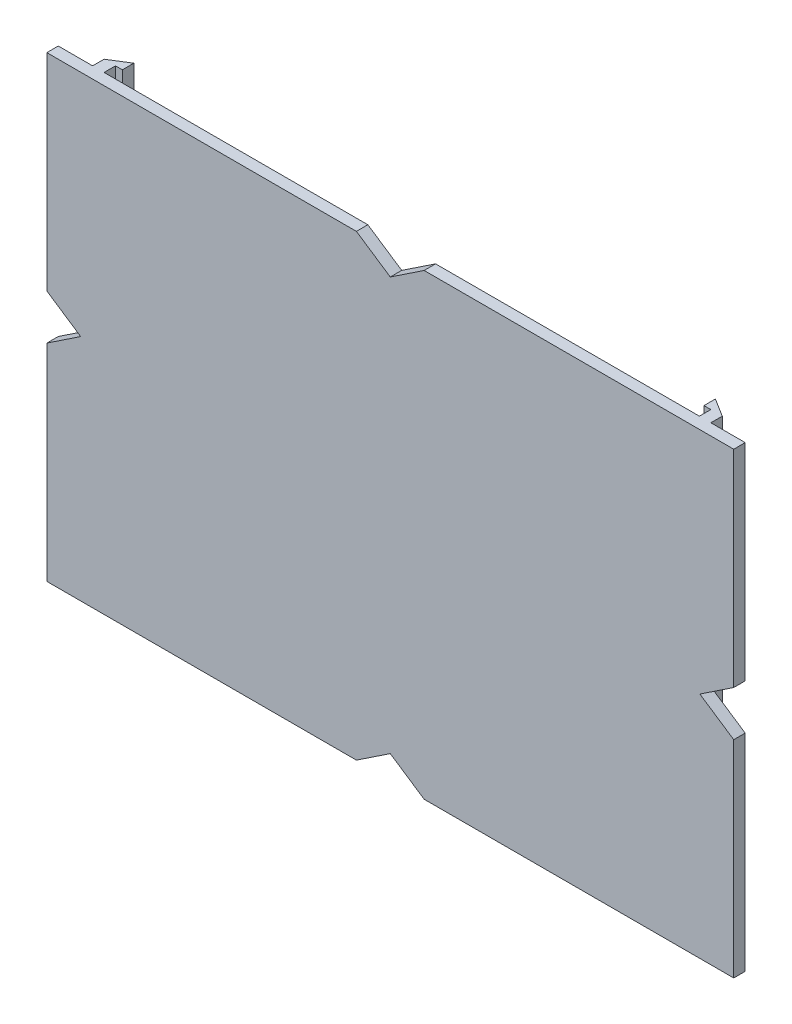
ISO-10303-21;
HEADER;
FILE_DESCRIPTION(('STEP AP214'),'2;1');
FILE_NAME('part.step','',(''),(''),'','','');
FILE_SCHEMA(('AUTOMOTIVE_DESIGN { 1 0 10303 214 1 1 1 1 }'));
ENDSEC;
DATA;
#1=APPLICATION_CONTEXT('core data for automotive mechanical design processes');
#2=APPLICATION_PROTOCOL_DEFINITION('international standard','automotive_design',2000,#1);
#3=PRODUCT_CONTEXT('',#1,'mechanical');
#4=PRODUCT('Part','Part','',(#3));
#5=PRODUCT_RELATED_PRODUCT_CATEGORY('part','',(#4));
#6=PRODUCT_DEFINITION_FORMATION('','',#4);
#7=PRODUCT_DEFINITION_CONTEXT('part definition',#1,'design');
#8=PRODUCT_DEFINITION('design','',#6,#7);
#9=PRODUCT_DEFINITION_SHAPE('','',#8);
#10=(LENGTH_UNIT() NAMED_UNIT(*) SI_UNIT(.MILLI.,.METRE.));
#11=(NAMED_UNIT(*) PLANE_ANGLE_UNIT() SI_UNIT($,.RADIAN.));
#12=(NAMED_UNIT(*) SI_UNIT($,.STERADIAN.) SOLID_ANGLE_UNIT());
#13=UNCERTAINTY_MEASURE_WITH_UNIT(LENGTH_MEASURE(1.E-05),#10,'distance_accuracy_value','');
#14=(GEOMETRIC_REPRESENTATION_CONTEXT(3) GLOBAL_UNCERTAINTY_ASSIGNED_CONTEXT((#13)) GLOBAL_UNIT_ASSIGNED_CONTEXT((#10,
#11,#12)) REPRESENTATION_CONTEXT('',''));
#15=CARTESIAN_POINT('',(0.,0.,0.));
#16=DIRECTION('',(0.,0.,1.));
#17=DIRECTION('',(1.,0.,0.));
#18=AXIS2_PLACEMENT_3D('',#15,#16,#17);
#19=CARTESIAN_POINT('',(0.,0.,0.));
#20=DIRECTION('',(0.,0.,1.));
#21=DIRECTION('',(1.,0.,0.));
#22=AXIS2_PLACEMENT_3D('',#19,#20,#21);
#23=PLANE('',#22);
#24=DIRECTION('',(0.,1.,0.));
#25=VECTOR('',#24,1.);
#26=CARTESIAN_POINT('',(130.,-112.806248474866,0.));
#27=LINE('',#26,#25);
#28=CARTESIAN_POINT('',(130.,-100.,0.));
#29=VERTEX_POINT('',#28);
#30=CARTESIAN_POINT('',(130.,100.,0.));
#31=VERTEX_POINT('',#30);
#32=EDGE_CURVE('E287',#29,#31,#27,.T.);
#33=ORIENTED_EDGE('',*,*,#32,.F.);
#34=DIRECTION('',(1.,0.,0.));
#35=VECTOR('',#34,1.);
#36=CARTESIAN_POINT('',(0.,-100.,0.));
#37=LINE('',#36,#35);
#38=CARTESIAN_POINT('',(14.7918271701004,-100.,0.));
#39=VERTEX_POINT('',#38);
#40=EDGE_CURVE('E442',#39,#29,#37,.T.);
#41=ORIENTED_EDGE('',*,*,#40,.F.);
#42=DIRECTION('',(0.832050294337844,-0.554700196225229,0.));
#43=VECTOR('',#42,1.);
#44=CARTESIAN_POINT('',(-41.6025147168922,-62.4037720753383,0.));
#45=LINE('',#44,#43);
#46=CARTESIAN_POINT('',(0.,-90.1387818865997,0.));
#47=VERTEX_POINT('',#46);
#48=EDGE_CURVE('E445',#47,#39,#45,.T.);
#49=ORIENTED_EDGE('',*,*,#48,.F.);
#50=DIRECTION('',(0.832050294337844,0.554700196225229,0.));
#51=VECTOR('',#50,1.);
#52=CARTESIAN_POINT('',(41.6025147168922,-62.4037720753382,0.));
#53=LINE('',#52,#51);
#54=CARTESIAN_POINT('',(-14.7918271701005,-100.,0.));
#55=VERTEX_POINT('',#54);
#56=EDGE_CURVE('E439',#55,#47,#53,.T.);
#57=ORIENTED_EDGE('',*,*,#56,.F.);
#58=CARTESIAN_POINT('',(-130.,-100.,0.));
#59=VERTEX_POINT('',#58);
#60=EDGE_CURVE('E440',#59,#55,#37,.T.);
#61=ORIENTED_EDGE('',*,*,#60,.F.);
#62=DIRECTION('',(0.,1.,0.));
#63=VECTOR('',#62,1.);
#64=CARTESIAN_POINT('',(-130.,-112.806248474866,0.));
#65=LINE('',#64,#63);
#66=CARTESIAN_POINT('',(-130.,100.,0.));
#67=VERTEX_POINT('',#66);
#68=EDGE_CURVE('E339',#59,#67,#65,.T.);
#69=ORIENTED_EDGE('',*,*,#68,.T.);
#70=DIRECTION('',(1.,0.,0.));
#71=VECTOR('',#70,1.);
#72=CARTESIAN_POINT('',(0.,100.,0.));
#73=LINE('',#72,#71);
#74=CARTESIAN_POINT('',(-14.7918271701004,100.,0.));
#75=VERTEX_POINT('',#74);
#76=EDGE_CURVE('E422',#67,#75,#73,.T.);
#77=ORIENTED_EDGE('',*,*,#76,.T.);
#78=DIRECTION('',(0.832050294337844,-0.554700196225229,0.));
#79=VECTOR('',#78,1.);
#80=CARTESIAN_POINT('',(41.6025147168922,62.4037720753382,0.));
#81=LINE('',#80,#79);
#82=CARTESIAN_POINT('',(0.,90.1387818865997,0.));
#83=VERTEX_POINT('',#82);
#84=EDGE_CURVE('E418',#75,#83,#81,.T.);
#85=ORIENTED_EDGE('',*,*,#84,.T.);
#86=DIRECTION('',(0.832050294337844,0.554700196225229,0.));
#87=VECTOR('',#86,1.);
#88=CARTESIAN_POINT('',(-41.6025147168922,62.4037720753383,0.));
#89=LINE('',#88,#87);
#90=CARTESIAN_POINT('',(14.7918271701004,100.,0.));
#91=VERTEX_POINT('',#90);
#92=EDGE_CURVE('E413',#83,#91,#89,.T.);
#93=ORIENTED_EDGE('',*,*,#92,.T.);
#94=EDGE_CURVE('E409',#91,#31,#73,.T.);
#95=ORIENTED_EDGE('',*,*,#94,.T.);
#96=EDGE_LOOP('',(#33,#41,#49,#57,#61,#69,#77,#85,#93,#95));
#97=FACE_BOUND('',#96,.T.);
#98=ADVANCED_FACE('F53',(#97),#23,.F.);
#99=DIRECTION('',(0.,1.,0.));
#100=VECTOR('',#99,1.);
#101=CARTESIAN_POINT('',(135.,-112.806248474866,0.));
#102=LINE('',#101,#100);
#103=CARTESIAN_POINT('',(135.,-100.,0.));
#104=VERTEX_POINT('',#103);
#105=CARTESIAN_POINT('',(135.,100.,0.));
#106=VERTEX_POINT('',#105);
#107=EDGE_CURVE('E69',#104,#106,#102,.T.);
#108=ORIENTED_EDGE('',*,*,#107,.T.);
#109=CARTESIAN_POINT('',(150.,100.,0.));
#110=VERTEX_POINT('',#109);
#111=EDGE_CURVE('E408',#106,#110,#73,.T.);
#112=ORIENTED_EDGE('',*,*,#111,.T.);
#113=DIRECTION('',(0.,-1.,0.));
#114=VECTOR('',#113,1.);
#115=CARTESIAN_POINT('',(150.,0.,0.));
#116=LINE('',#115,#114);
#117=CARTESIAN_POINT('',(150.,9.86121811340041,0.));
#118=VERTEX_POINT('',#117);
#119=EDGE_CURVE('E404',#110,#118,#116,.T.);
#120=ORIENTED_EDGE('',*,*,#119,.T.);
#121=DIRECTION('',(0.832050294337844,0.554700196225229,0.));
#122=VECTOR('',#121,1.);
#123=CARTESIAN_POINT('',(41.6025147168922,-62.4037720753382,0.));
#124=LINE('',#123,#122);
#125=CARTESIAN_POINT('',(135.208172829899,0.,0.));
#126=VERTEX_POINT('',#125);
#127=EDGE_CURVE('E400',#126,#118,#124,.T.);
#128=ORIENTED_EDGE('',*,*,#127,.F.);
#129=DIRECTION('',(0.832050294337844,-0.554700196225229,0.));
#130=VECTOR('',#129,1.);
#131=CARTESIAN_POINT('',(41.6025147168921,62.4037720753382,0.));
#132=LINE('',#131,#130);
#133=CARTESIAN_POINT('',(150.,-9.86121811340035,0.));
#134=VERTEX_POINT('',#133);
#135=EDGE_CURVE('E349',#126,#134,#132,.T.);
#136=ORIENTED_EDGE('',*,*,#135,.T.);
#137=CARTESIAN_POINT('',(150.,-100.,0.));
#138=VERTEX_POINT('',#137);
#139=EDGE_CURVE('E355',#134,#138,#116,.T.);
#140=ORIENTED_EDGE('',*,*,#139,.T.);
#141=EDGE_CURVE('E441',#104,#138,#37,.T.);
#142=ORIENTED_EDGE('',*,*,#141,.F.);
#143=EDGE_LOOP('',(#108,#112,#120,#128,#136,#140,#142));
#144=FACE_BOUND('',#143,.T.);
#145=ADVANCED_FACE('F509',(#144),#23,.F.);
#146=DIRECTION('',(0.,1.,0.));
#147=VECTOR('',#146,1.);
#148=CARTESIAN_POINT('',(-135.,-112.806248474866,0.));
#149=LINE('',#148,#147);
#150=CARTESIAN_POINT('',(-135.,-100.,0.));
#151=VERTEX_POINT('',#150);
#152=CARTESIAN_POINT('',(-135.,100.,0.));
#153=VERTEX_POINT('',#152);
#154=EDGE_CURVE('E342',#151,#153,#149,.T.);
#155=ORIENTED_EDGE('',*,*,#154,.F.);
#156=CARTESIAN_POINT('',(-150.,-100.,0.));
#157=VERTEX_POINT('',#156);
#158=EDGE_CURVE('E435',#157,#151,#37,.T.);
#159=ORIENTED_EDGE('',*,*,#158,.F.);
#160=DIRECTION('',(0.,-1.,0.));
#161=VECTOR('',#160,1.);
#162=CARTESIAN_POINT('',(-150.,0.,0.));
#163=LINE('',#162,#161);
#164=CARTESIAN_POINT('',(-150.,-9.86121811340024,0.));
#165=VERTEX_POINT('',#164);
#166=EDGE_CURVE('E427',#165,#157,#163,.T.);
#167=ORIENTED_EDGE('',*,*,#166,.F.);
#168=DIRECTION('',(0.832050294337844,0.554700196225229,0.));
#169=VECTOR('',#168,1.);
#170=CARTESIAN_POINT('',(-41.6025147168922,62.4037720753383,0.));
#171=LINE('',#170,#169);
#172=CARTESIAN_POINT('',(-135.2081728299,0.,0.));
#173=VERTEX_POINT('',#172);
#174=EDGE_CURVE('E431',#165,#173,#171,.T.);
#175=ORIENTED_EDGE('',*,*,#174,.T.);
#176=DIRECTION('',(0.832050294337844,-0.554700196225229,0.));
#177=VECTOR('',#176,1.);
#178=CARTESIAN_POINT('',(-41.6025147168921,-62.4037720753383,0.));
#179=LINE('',#178,#177);
#180=CARTESIAN_POINT('',(-150.,9.86121811340027,0.));
#181=VERTEX_POINT('',#180);
#182=EDGE_CURVE('E426',#181,#173,#179,.T.);
#183=ORIENTED_EDGE('',*,*,#182,.F.);
#184=CARTESIAN_POINT('',(-150.,100.,0.));
#185=VERTEX_POINT('',#184);
#186=EDGE_CURVE('E423',#185,#181,#163,.T.);
#187=ORIENTED_EDGE('',*,*,#186,.F.);
#188=EDGE_CURVE('E414',#185,#153,#73,.T.);
#189=ORIENTED_EDGE('',*,*,#188,.T.);
#190=EDGE_LOOP('',(#155,#159,#167,#175,#183,#187,#189));
#191=FACE_BOUND('',#190,.T.);
#192=ADVANCED_FACE('F547',(#191),#23,.F.);
#193=CARTESIAN_POINT('',(41.6025147168921,62.4037720753382,5.));
#194=DIRECTION('',(0.554700196225229,0.832050294337844,0.));
#195=DIRECTION('',(-0.832050294337844,0.554700196225229,0.));
#196=AXIS2_PLACEMENT_3D('',#193,#194,#195);
#197=PLANE('',#196);
#198=ORIENTED_EDGE('',*,*,#135,.F.);
#199=DIRECTION('',(0.,0.,-1.));
#200=VECTOR('',#199,1.);
#201=CARTESIAN_POINT('',(135.208172829899,0.,5.));
#202=LINE('',#201,#200);
#203=CARTESIAN_POINT('',(135.208172829899,0.,5.));
#204=VERTEX_POINT('',#203);
#205=EDGE_CURVE('E11',#204,#126,#202,.T.);
#206=ORIENTED_EDGE('',*,*,#205,.F.);
#207=DIRECTION('',(0.832050294337844,-0.554700196225229,0.));
#208=VECTOR('',#207,1.);
#209=CARTESIAN_POINT('',(41.6025147168921,62.4037720753382,5.));
#210=LINE('',#209,#208);
#211=CARTESIAN_POINT('',(150.,-9.86121811340035,5.));
#212=VERTEX_POINT('',#211);
#213=EDGE_CURVE('E350',#204,#212,#210,.T.);
#214=ORIENTED_EDGE('',*,*,#213,.T.);
#215=DIRECTION('',(0.,0.,-1.));
#216=VECTOR('',#215,1.);
#217=CARTESIAN_POINT('',(150.,-9.86121811340035,5.));
#218=LINE('',#217,#216);
#219=EDGE_CURVE('E448',#212,#134,#218,.T.);
#220=ORIENTED_EDGE('',*,*,#219,.T.);
#221=EDGE_LOOP('',(#198,#206,#214,#220));
#222=FACE_BOUND('',#221,.T.);
#223=ADVANCED_FACE('F55',(#222),#197,.T.);
#224=CARTESIAN_POINT('',(41.6025147168922,-62.4037720753382,5.));
#225=DIRECTION('',(-0.554700196225229,0.832050294337844,0.));
#226=DIRECTION('',(-0.832050294337844,-0.554700196225229,0.));
#227=AXIS2_PLACEMENT_3D('',#224,#225,#226);
#228=PLANE('',#227);
#229=ORIENTED_EDGE('',*,*,#127,.T.);
#230=DIRECTION('',(0.,0.,-1.));
#231=VECTOR('',#230,1.);
#232=CARTESIAN_POINT('',(150.,9.86121811340041,5.));
#233=LINE('',#232,#231);
#234=CARTESIAN_POINT('',(150.,9.86121811340041,5.));
#235=VERTEX_POINT('',#234);
#236=EDGE_CURVE('E62',#235,#118,#233,.T.);
#237=ORIENTED_EDGE('',*,*,#236,.F.);
#238=DIRECTION('',(0.832050294337844,0.554700196225229,0.));
#239=VECTOR('',#238,1.);
#240=CARTESIAN_POINT('',(41.6025147168922,-62.4037720753382,5.));
#241=LINE('',#240,#239);
#242=EDGE_CURVE('E354',#204,#235,#241,.T.);
#243=ORIENTED_EDGE('',*,*,#242,.F.);
#244=ORIENTED_EDGE('',*,*,#205,.T.);
#245=EDGE_LOOP('',(#229,#237,#243,#244));
#246=FACE_BOUND('',#245,.T.);
#247=ADVANCED_FACE('F506',(#246),#228,.F.);
#248=CARTESIAN_POINT('',(150.,0.,5.));
#249=DIRECTION('',(1.,0.,0.));
#250=DIRECTION('',(0.,0.,-1.));
#251=AXIS2_PLACEMENT_3D('',#248,#249,#250);
#252=PLANE('',#251);
#253=ORIENTED_EDGE('',*,*,#119,.F.);
#254=DIRECTION('',(0.,0.,-1.));
#255=VECTOR('',#254,1.);
#256=CARTESIAN_POINT('',(150.,100.,5.));
#257=LINE('',#256,#255);
#258=CARTESIAN_POINT('',(150.,100.,5.));
#259=VERTEX_POINT('',#258);
#260=EDGE_CURVE('E494',#259,#110,#257,.T.);
#261=ORIENTED_EDGE('',*,*,#260,.F.);
#262=DIRECTION('',(0.,-1.,0.));
#263=VECTOR('',#262,1.);
#264=CARTESIAN_POINT('',(150.,0.,5.));
#265=LINE('',#264,#263);
#266=EDGE_CURVE('E358',#259,#235,#265,.T.);
#267=ORIENTED_EDGE('',*,*,#266,.T.);
#268=ORIENTED_EDGE('',*,*,#236,.T.);
#269=EDGE_LOOP('',(#253,#261,#267,#268));
#270=FACE_BOUND('',#269,.T.);
#271=ADVANCED_FACE('F501',(#270),#252,.T.);
#272=CARTESIAN_POINT('',(0.,100.,5.));
#273=DIRECTION('',(0.,1.,0.));
#274=DIRECTION('',(0.,0.,1.));
#275=AXIS2_PLACEMENT_3D('',#272,#273,#274);
#276=PLANE('',#275);
#277=ORIENTED_EDGE('',*,*,#94,.F.);
#278=DIRECTION('',(0.,0.,-1.));
#279=VECTOR('',#278,1.);
#280=CARTESIAN_POINT('',(14.7918271701004,100.,5.));
#281=LINE('',#280,#279);
#282=CARTESIAN_POINT('',(14.7918271701004,100.,5.));
#283=VERTEX_POINT('',#282);
#284=EDGE_CURVE('E491',#283,#91,#281,.T.);
#285=ORIENTED_EDGE('',*,*,#284,.F.);
#286=DIRECTION('',(1.,0.,0.));
#287=VECTOR('',#286,1.);
#288=CARTESIAN_POINT('',(0.,100.,5.));
#289=LINE('',#288,#287);
#290=EDGE_CURVE('E362',#283,#259,#289,.T.);
#291=ORIENTED_EDGE('',*,*,#290,.T.);
#292=ORIENTED_EDGE('',*,*,#260,.T.);
#293=ORIENTED_EDGE('',*,*,#111,.F.);
#294=DIRECTION('',(0.,0.,1.));
#295=VECTOR('',#294,1.);
#296=CARTESIAN_POINT('',(135.,100.,0.));
#297=LINE('',#296,#295);
#298=CARTESIAN_POINT('',(135.,100.,-5.00000000000003));
#299=VERTEX_POINT('',#298);
#300=EDGE_CURVE('E252',#299,#106,#297,.T.);
#301=ORIENTED_EDGE('',*,*,#300,.F.);
#302=DIRECTION('',(0.847998304005088,0.,0.52999894000318));
#303=VECTOR('',#302,1.);
#304=CARTESIAN_POINT('',(40.1685393258427,100.,-64.2696629213483));
#305=LINE('',#304,#303);
#306=CARTESIAN_POINT('',(127.,100.,-10.));
#307=VERTEX_POINT('',#306);
#308=EDGE_CURVE('E246',#307,#299,#305,.T.);
#309=ORIENTED_EDGE('',*,*,#308,.F.);
#310=DIRECTION('',(0.,0.,-1.));
#311=VECTOR('',#310,1.);
#312=CARTESIAN_POINT('',(127.,100.,0.));
#313=LINE('',#312,#311);
#314=CARTESIAN_POINT('',(127.,100.,-5.));
#315=VERTEX_POINT('',#314);
#316=EDGE_CURVE('E255',#315,#307,#313,.T.);
#317=ORIENTED_EDGE('',*,*,#316,.F.);
#318=DIRECTION('',(-1.,0.,0.));
#319=VECTOR('',#318,1.);
#320=CARTESIAN_POINT('',(0.,100.,-5.));
#321=LINE('',#320,#319);
#322=CARTESIAN_POINT('',(130.,100.,-5.));
#323=VERTEX_POINT('',#322);
#324=EDGE_CURVE('E262',#323,#315,#321,.T.);
#325=ORIENTED_EDGE('',*,*,#324,.F.);
#326=DIRECTION('',(0.,0.,-1.));
#327=VECTOR('',#326,1.);
#328=CARTESIAN_POINT('',(130.,100.,0.));
#329=LINE('',#328,#327);
#330=EDGE_CURVE('E275',#31,#323,#329,.T.);
#331=ORIENTED_EDGE('',*,*,#330,.F.);
#332=EDGE_LOOP('',(#277,#285,#291,#292,#293,#301,#309,#317,#325,#331));
#333=FACE_BOUND('',#332,.T.);
#334=ADVANCED_FACE('F266',(#333),#276,.T.);
#335=CARTESIAN_POINT('',(-41.6025147168922,62.4037720753383,5.));
#336=DIRECTION('',(-0.554700196225229,0.832050294337844,0.));
#337=DIRECTION('',(-0.832050294337844,-0.554700196225229,0.));
#338=AXIS2_PLACEMENT_3D('',#335,#336,#337);
#339=PLANE('',#338);
#340=ORIENTED_EDGE('',*,*,#92,.F.);
#341=DIRECTION('',(0.,0.,-1.));
#342=VECTOR('',#341,1.);
#343=CARTESIAN_POINT('',(0.,90.1387818865997,5.));
#344=LINE('',#343,#342);
#345=CARTESIAN_POINT('',(0.,90.1387818865997,5.));
#346=VERTEX_POINT('',#345);
#347=EDGE_CURVE('E488',#346,#83,#344,.T.);
#348=ORIENTED_EDGE('',*,*,#347,.F.);
#349=DIRECTION('',(0.832050294337844,0.554700196225229,0.));
#350=VECTOR('',#349,1.);
#351=CARTESIAN_POINT('',(-41.6025147168922,62.4037720753383,5.));
#352=LINE('',#351,#350);
#353=EDGE_CURVE('E367',#346,#283,#352,.T.);
#354=ORIENTED_EDGE('',*,*,#353,.T.);
#355=ORIENTED_EDGE('',*,*,#284,.T.);
#356=EDGE_LOOP('',(#340,#348,#354,#355));
#357=FACE_BOUND('',#356,.T.);
#358=ADVANCED_FACE('F597',(#357),#339,.T.);
#359=CARTESIAN_POINT('',(41.6025147168922,62.4037720753382,5.));
#360=DIRECTION('',(0.554700196225229,0.832050294337844,0.));
#361=DIRECTION('',(-0.832050294337844,0.554700196225229,0.));
#362=AXIS2_PLACEMENT_3D('',#359,#360,#361);
#363=PLANE('',#362);
#364=ORIENTED_EDGE('',*,*,#84,.F.);
#365=DIRECTION('',(0.,0.,-1.));
#366=VECTOR('',#365,1.);
#367=CARTESIAN_POINT('',(-14.7918271701004,100.,5.));
#368=LINE('',#367,#366);
#369=CARTESIAN_POINT('',(-14.7918271701004,100.,5.));
#370=VERTEX_POINT('',#369);
#371=EDGE_CURVE('E484',#370,#75,#368,.T.);
#372=ORIENTED_EDGE('',*,*,#371,.F.);
#373=DIRECTION('',(0.832050294337844,-0.554700196225229,0.));
#374=VECTOR('',#373,1.);
#375=CARTESIAN_POINT('',(41.6025147168922,62.4037720753382,5.));
#376=LINE('',#375,#374);
#377=EDGE_CURVE('E372',#370,#346,#376,.T.);
#378=ORIENTED_EDGE('',*,*,#377,.T.);
#379=ORIENTED_EDGE('',*,*,#347,.T.);
#380=EDGE_LOOP('',(#364,#372,#378,#379));
#381=FACE_BOUND('',#380,.T.);
#382=ADVANCED_FACE('F601',(#381),#363,.T.);
#383=ORIENTED_EDGE('',*,*,#188,.F.);
#384=DIRECTION('',(0.,0.,-1.));
#385=VECTOR('',#384,1.);
#386=CARTESIAN_POINT('',(-150.,100.,5.));
#387=LINE('',#386,#385);
#388=CARTESIAN_POINT('',(-150.,100.,5.));
#389=VERTEX_POINT('',#388);
#390=EDGE_CURVE('E481',#389,#185,#387,.T.);
#391=ORIENTED_EDGE('',*,*,#390,.F.);
#392=EDGE_CURVE('E368',#389,#370,#289,.T.);
#393=ORIENTED_EDGE('',*,*,#392,.T.);
#394=ORIENTED_EDGE('',*,*,#371,.T.);
#395=ORIENTED_EDGE('',*,*,#76,.F.);
#396=DIRECTION('',(0.,0.,-1.));
#397=VECTOR('',#396,1.);
#398=CARTESIAN_POINT('',(-130.,100.,0.));
#399=LINE('',#398,#397);
#400=CARTESIAN_POINT('',(-130.,100.,-5.));
#401=VERTEX_POINT('',#400);
#402=EDGE_CURVE('E77',#67,#401,#399,.T.);
#403=ORIENTED_EDGE('',*,*,#402,.T.);
#404=DIRECTION('',(1.,0.,0.));
#405=VECTOR('',#404,1.);
#406=CARTESIAN_POINT('',(0.,100.,-5.));
#407=LINE('',#406,#405);
#408=CARTESIAN_POINT('',(-127.,100.,-5.));
#409=VERTEX_POINT('',#408);
#410=EDGE_CURVE('E322',#401,#409,#407,.T.);
#411=ORIENTED_EDGE('',*,*,#410,.T.);
#412=DIRECTION('',(0.,0.,-1.));
#413=VECTOR('',#412,1.);
#414=CARTESIAN_POINT('',(-127.,100.,0.));
#415=LINE('',#414,#413);
#416=CARTESIAN_POINT('',(-127.,100.,-10.));
#417=VERTEX_POINT('',#416);
#418=EDGE_CURVE('E326',#409,#417,#415,.T.);
#419=ORIENTED_EDGE('',*,*,#418,.T.);
#420=DIRECTION('',(-0.847998304005088,0.,0.52999894000318));
#421=VECTOR('',#420,1.);
#422=CARTESIAN_POINT('',(-40.1685393258427,100.,-64.2696629213483));
#423=LINE('',#422,#421);
#424=CARTESIAN_POINT('',(-135.,100.,-5.00000000000003));
#425=VERTEX_POINT('',#424);
#426=EDGE_CURVE('E312',#417,#425,#423,.T.);
#427=ORIENTED_EDGE('',*,*,#426,.T.);
#428=DIRECTION('',(0.,0.,1.));
#429=VECTOR('',#428,1.);
#430=CARTESIAN_POINT('',(-135.,100.,0.));
#431=LINE('',#430,#429);
#432=EDGE_CURVE('E316',#425,#153,#431,.T.);
#433=ORIENTED_EDGE('',*,*,#432,.T.);
#434=EDGE_LOOP('',(#383,#391,#393,#394,#395,#403,#411,#419,#427,#433));
#435=FACE_BOUND('',#434,.T.);
#436=ADVANCED_FACE('F556',(#435),#276,.T.);
#437=CARTESIAN_POINT('',(-150.,0.,5.));
#438=DIRECTION('',(1.,0.,0.));
#439=DIRECTION('',(0.,1.,0.));
#440=AXIS2_PLACEMENT_3D('',#437,#438,#439);
#441=PLANE('',#440);
#442=ORIENTED_EDGE('',*,*,#186,.T.);
#443=DIRECTION('',(0.,0.,-1.));
#444=VECTOR('',#443,1.);
#445=CARTESIAN_POINT('',(-150.,9.86121811340027,5.));
#446=LINE('',#445,#444);
#447=CARTESIAN_POINT('',(-150.,9.86121811340027,5.));
#448=VERTEX_POINT('',#447);
#449=EDGE_CURVE('E477',#448,#181,#446,.T.);
#450=ORIENTED_EDGE('',*,*,#449,.F.);
#451=DIRECTION('',(0.,-1.,0.));
#452=VECTOR('',#451,1.);
#453=CARTESIAN_POINT('',(-150.,0.,5.));
#454=LINE('',#453,#452);
#455=EDGE_CURVE('E376',#389,#448,#454,.T.);
#456=ORIENTED_EDGE('',*,*,#455,.F.);
#457=ORIENTED_EDGE('',*,*,#390,.T.);
#458=EDGE_LOOP('',(#442,#450,#456,#457));
#459=FACE_BOUND('',#458,.T.);
#460=ADVANCED_FACE('F609',(#459),#441,.F.);
#461=CARTESIAN_POINT('',(-41.6025147168921,-62.4037720753383,5.));
#462=DIRECTION('',(0.554700196225229,0.832050294337844,0.));
#463=DIRECTION('',(-0.832050294337844,0.554700196225229,0.));
#464=AXIS2_PLACEMENT_3D('',#461,#462,#463);
#465=PLANE('',#464);
#466=ORIENTED_EDGE('',*,*,#182,.T.);
#467=DIRECTION('',(0.,0.,-1.));
#468=VECTOR('',#467,1.);
#469=CARTESIAN_POINT('',(-135.2081728299,0.,5.));
#470=LINE('',#469,#468);
#471=CARTESIAN_POINT('',(-135.2081728299,0.,5.));
#472=VERTEX_POINT('',#471);
#473=EDGE_CURVE('E474',#472,#173,#470,.T.);
#474=ORIENTED_EDGE('',*,*,#473,.F.);
#475=DIRECTION('',(0.832050294337844,-0.554700196225229,0.));
#476=VECTOR('',#475,1.);
#477=CARTESIAN_POINT('',(-41.6025147168921,-62.4037720753383,5.));
#478=LINE('',#477,#476);
#479=EDGE_CURVE('E379',#448,#472,#478,.T.);
#480=ORIENTED_EDGE('',*,*,#479,.F.);
#481=ORIENTED_EDGE('',*,*,#449,.T.);
#482=EDGE_LOOP('',(#466,#474,#480,#481));
#483=FACE_BOUND('',#482,.T.);
#484=ADVANCED_FACE('F660',(#483),#465,.F.);
#485=CARTESIAN_POINT('',(-41.6025147168922,62.4037720753383,5.));
#486=DIRECTION('',(-0.554700196225229,0.832050294337844,0.));
#487=DIRECTION('',(-0.832050294337844,-0.554700196225229,0.));
#488=AXIS2_PLACEMENT_3D('',#485,#486,#487);
#489=PLANE('',#488);
#490=ORIENTED_EDGE('',*,*,#174,.F.);
#491=DIRECTION('',(0.,0.,-1.));
#492=VECTOR('',#491,1.);
#493=CARTESIAN_POINT('',(-150.,-9.86121811340024,5.));
#494=LINE('',#493,#492);
#495=CARTESIAN_POINT('',(-150.,-9.86121811340024,5.));
#496=VERTEX_POINT('',#495);
#497=EDGE_CURVE('E471',#496,#165,#494,.T.);
#498=ORIENTED_EDGE('',*,*,#497,.F.);
#499=DIRECTION('',(0.832050294337844,0.554700196225229,0.));
#500=VECTOR('',#499,1.);
#501=CARTESIAN_POINT('',(-41.6025147168922,62.4037720753383,5.));
#502=LINE('',#501,#500);
#503=EDGE_CURVE('E383',#496,#472,#502,.T.);
#504=ORIENTED_EDGE('',*,*,#503,.T.);
#505=ORIENTED_EDGE('',*,*,#473,.T.);
#506=EDGE_LOOP('',(#490,#498,#504,#505));
#507=FACE_BOUND('',#506,.T.);
#508=ADVANCED_FACE('F655',(#507),#489,.T.);
#509=ORIENTED_EDGE('',*,*,#166,.T.);
#510=DIRECTION('',(0.,0.,-1.));
#511=VECTOR('',#510,1.);
#512=CARTESIAN_POINT('',(-150.,-100.,5.));
#513=LINE('',#512,#511);
#514=CARTESIAN_POINT('',(-150.,-100.,5.));
#515=VERTEX_POINT('',#514);
#516=EDGE_CURVE('E467',#515,#157,#513,.T.);
#517=ORIENTED_EDGE('',*,*,#516,.F.);
#518=EDGE_CURVE('E380',#496,#515,#454,.T.);
#519=ORIENTED_EDGE('',*,*,#518,.F.);
#520=ORIENTED_EDGE('',*,*,#497,.T.);
#521=EDGE_LOOP('',(#509,#517,#519,#520));
#522=FACE_BOUND('',#521,.T.);
#523=ADVANCED_FACE('F539',(#522),#441,.F.);
#524=CARTESIAN_POINT('',(0.,-100.,5.));
#525=DIRECTION('',(0.,1.,0.));
#526=DIRECTION('',(0.,0.,1.));
#527=AXIS2_PLACEMENT_3D('',#524,#525,#526);
#528=PLANE('',#527);
#529=ORIENTED_EDGE('',*,*,#158,.T.);
#530=DIRECTION('',(0.,0.,-1.));
#531=VECTOR('',#530,1.);
#532=CARTESIAN_POINT('',(-135.,-100.,0.));
#533=LINE('',#532,#531);
#534=CARTESIAN_POINT('',(-135.,-100.,-5.00000000000003));
#535=VERTEX_POINT('',#534);
#536=EDGE_CURVE('E311',#151,#535,#533,.T.);
#537=ORIENTED_EDGE('',*,*,#536,.T.);
#538=DIRECTION('',(0.847998304005088,0.,-0.52999894000318));
#539=VECTOR('',#538,1.);
#540=CARTESIAN_POINT('',(-40.1685393258427,-100.,-64.2696629213483));
#541=LINE('',#540,#539);
#542=CARTESIAN_POINT('',(-127.,-100.,-10.));
#543=VERTEX_POINT('',#542);
#544=EDGE_CURVE('E308',#535,#543,#541,.T.);
#545=ORIENTED_EDGE('',*,*,#544,.T.);
#546=DIRECTION('',(0.,0.,1.));
#547=VECTOR('',#546,1.);
#548=CARTESIAN_POINT('',(-127.,-100.,0.));
#549=LINE('',#548,#547);
#550=CARTESIAN_POINT('',(-127.,-100.,-5.));
#551=VERTEX_POINT('',#550);
#552=EDGE_CURVE('E305',#543,#551,#549,.T.);
#553=ORIENTED_EDGE('',*,*,#552,.T.);
#554=DIRECTION('',(-1.,0.,0.));
#555=VECTOR('',#554,1.);
#556=CARTESIAN_POINT('',(0.,-100.,-5.));
#557=LINE('',#556,#555);
#558=CARTESIAN_POINT('',(-130.,-100.,-5.));
#559=VERTEX_POINT('',#558);
#560=EDGE_CURVE('E301',#551,#559,#557,.T.);
#561=ORIENTED_EDGE('',*,*,#560,.T.);
#562=DIRECTION('',(0.,0.,1.));
#563=VECTOR('',#562,1.);
#564=CARTESIAN_POINT('',(-130.,-100.,0.));
#565=LINE('',#564,#563);
#566=EDGE_CURVE('E298',#559,#59,#565,.T.);
#567=ORIENTED_EDGE('',*,*,#566,.T.);
#568=ORIENTED_EDGE('',*,*,#60,.T.);
#569=DIRECTION('',(0.,0.,-1.));
#570=VECTOR('',#569,1.);
#571=CARTESIAN_POINT('',(-14.7918271701005,-100.,5.));
#572=LINE('',#571,#570);
#573=CARTESIAN_POINT('',(-14.7918271701005,-100.,5.));
#574=VERTEX_POINT('',#573);
#575=EDGE_CURVE('E463',#574,#55,#572,.T.);
#576=ORIENTED_EDGE('',*,*,#575,.F.);
#577=DIRECTION('',(1.,0.,0.));
#578=VECTOR('',#577,1.);
#579=CARTESIAN_POINT('',(0.,-100.,5.));
#580=LINE('',#579,#578);
#581=EDGE_CURVE('E387',#515,#574,#580,.T.);
#582=ORIENTED_EDGE('',*,*,#581,.F.);
#583=ORIENTED_EDGE('',*,*,#516,.T.);
#584=EDGE_LOOP('',(#529,#537,#545,#553,#561,#567,#568,#576,#582,#583));
#585=FACE_BOUND('',#584,.T.);
#586=ADVANCED_FACE('F545',(#585),#528,.F.);
#587=CARTESIAN_POINT('',(41.6025147168922,-62.4037720753382,5.));
#588=DIRECTION('',(-0.554700196225229,0.832050294337844,0.));
#589=DIRECTION('',(-0.832050294337844,-0.554700196225229,0.));
#590=AXIS2_PLACEMENT_3D('',#587,#588,#589);
#591=PLANE('',#590);
#592=ORIENTED_EDGE('',*,*,#56,.T.);
#593=DIRECTION('',(0.,0.,-1.));
#594=VECTOR('',#593,1.);
#595=CARTESIAN_POINT('',(0.,-90.1387818865997,5.));
#596=LINE('',#595,#594);
#597=CARTESIAN_POINT('',(0.,-90.1387818865997,5.));
#598=VERTEX_POINT('',#597);
#599=EDGE_CURVE('E459',#598,#47,#596,.T.);
#600=ORIENTED_EDGE('',*,*,#599,.F.);
#601=DIRECTION('',(0.832050294337844,0.554700196225229,0.));
#602=VECTOR('',#601,1.);
#603=CARTESIAN_POINT('',(41.6025147168922,-62.4037720753382,5.));
#604=LINE('',#603,#602);
#605=EDGE_CURVE('E390',#574,#598,#604,.T.);
#606=ORIENTED_EDGE('',*,*,#605,.F.);
#607=ORIENTED_EDGE('',*,*,#575,.T.);
#608=EDGE_LOOP('',(#592,#600,#606,#607));
#609=FACE_BOUND('',#608,.T.);
#610=ADVANCED_FACE('F644',(#609),#591,.F.);
#611=CARTESIAN_POINT('',(-41.6025147168922,-62.4037720753383,5.));
#612=DIRECTION('',(0.554700196225229,0.832050294337844,0.));
#613=DIRECTION('',(-0.832050294337844,0.554700196225229,0.));
#614=AXIS2_PLACEMENT_3D('',#611,#612,#613);
#615=PLANE('',#614);
#616=ORIENTED_EDGE('',*,*,#48,.T.);
#617=DIRECTION('',(0.,0.,-1.));
#618=VECTOR('',#617,1.);
#619=CARTESIAN_POINT('',(14.7918271701004,-100.,5.));
#620=LINE('',#619,#618);
#621=CARTESIAN_POINT('',(14.7918271701004,-100.,5.));
#622=VERTEX_POINT('',#621);
#623=EDGE_CURVE('E455',#622,#39,#620,.T.);
#624=ORIENTED_EDGE('',*,*,#623,.F.);
#625=DIRECTION('',(0.832050294337844,-0.554700196225229,0.));
#626=VECTOR('',#625,1.);
#627=CARTESIAN_POINT('',(-41.6025147168922,-62.4037720753383,5.));
#628=LINE('',#627,#626);
#629=EDGE_CURVE('E394',#598,#622,#628,.T.);
#630=ORIENTED_EDGE('',*,*,#629,.F.);
#631=ORIENTED_EDGE('',*,*,#599,.T.);
#632=EDGE_LOOP('',(#616,#624,#630,#631));
#633=FACE_BOUND('',#632,.T.);
#634=ADVANCED_FACE('F640',(#633),#615,.F.);
#635=ORIENTED_EDGE('',*,*,#40,.T.);
#636=DIRECTION('',(0.,0.,1.));
#637=VECTOR('',#636,1.);
#638=CARTESIAN_POINT('',(130.,-100.,0.));
#639=LINE('',#638,#637);
#640=CARTESIAN_POINT('',(130.,-100.,-5.));
#641=VERTEX_POINT('',#640);
#642=EDGE_CURVE('E582',#641,#29,#639,.T.);
#643=ORIENTED_EDGE('',*,*,#642,.F.);
#644=DIRECTION('',(1.,0.,0.));
#645=VECTOR('',#644,1.);
#646=CARTESIAN_POINT('',(0.,-100.,-5.));
#647=LINE('',#646,#645);
#648=CARTESIAN_POINT('',(127.,-100.,-5.));
#649=VERTEX_POINT('',#648);
#650=EDGE_CURVE('E297',#649,#641,#647,.T.);
#651=ORIENTED_EDGE('',*,*,#650,.F.);
#652=DIRECTION('',(0.,0.,1.));
#653=VECTOR('',#652,1.);
#654=CARTESIAN_POINT('',(127.,-100.,0.));
#655=LINE('',#654,#653);
#656=CARTESIAN_POINT('',(127.,-100.,-10.));
#657=VERTEX_POINT('',#656);
#658=EDGE_CURVE('E284',#657,#649,#655,.T.);
#659=ORIENTED_EDGE('',*,*,#658,.F.);
#660=DIRECTION('',(-0.847998304005088,0.,-0.52999894000318));
#661=VECTOR('',#660,1.);
#662=CARTESIAN_POINT('',(40.1685393258427,-100.,-64.2696629213483));
#663=LINE('',#662,#661);
#664=CARTESIAN_POINT('',(135.,-100.,-5.00000000000003));
#665=VERTEX_POINT('',#664);
#666=EDGE_CURVE('E247',#665,#657,#663,.T.);
#667=ORIENTED_EDGE('',*,*,#666,.F.);
#668=DIRECTION('',(0.,0.,-1.));
#669=VECTOR('',#668,1.);
#670=CARTESIAN_POINT('',(135.,-100.,0.));
#671=LINE('',#670,#669);
#672=EDGE_CURVE('E580',#104,#665,#671,.T.);
#673=ORIENTED_EDGE('',*,*,#672,.F.);
#674=ORIENTED_EDGE('',*,*,#141,.T.);
#675=DIRECTION('',(0.,0.,-1.));
#676=VECTOR('',#675,1.);
#677=CARTESIAN_POINT('',(150.,-100.,5.));
#678=LINE('',#677,#676);
#679=CARTESIAN_POINT('',(150.,-100.,5.));
#680=VERTEX_POINT('',#679);
#681=EDGE_CURVE('E451',#680,#138,#678,.T.);
#682=ORIENTED_EDGE('',*,*,#681,.F.);
#683=EDGE_CURVE('E391',#622,#680,#580,.T.);
#684=ORIENTED_EDGE('',*,*,#683,.F.);
#685=ORIENTED_EDGE('',*,*,#623,.T.);
#686=EDGE_LOOP('',(#635,#643,#651,#659,#667,#673,#674,#682,#684,#685));
#687=FACE_BOUND('',#686,.T.);
#688=ADVANCED_FACE('F590',(#687),#528,.F.);
#689=ORIENTED_EDGE('',*,*,#139,.F.);
#690=ORIENTED_EDGE('',*,*,#219,.F.);
#691=EDGE_CURVE('E363',#212,#680,#265,.T.);
#692=ORIENTED_EDGE('',*,*,#691,.T.);
#693=ORIENTED_EDGE('',*,*,#681,.T.);
#694=EDGE_LOOP('',(#689,#690,#692,#693));
#695=FACE_BOUND('',#694,.T.);
#696=ADVANCED_FACE('F523',(#695),#252,.T.);
#697=CARTESIAN_POINT('',(0.,0.,5.));
#698=DIRECTION('',(0.,0.,1.));
#699=DIRECTION('',(1.,0.,0.));
#700=AXIS2_PLACEMENT_3D('',#697,#698,#699);
#701=PLANE('',#700);
#702=ORIENTED_EDGE('',*,*,#213,.F.);
#703=ORIENTED_EDGE('',*,*,#242,.T.);
#704=ORIENTED_EDGE('',*,*,#266,.F.);
#705=ORIENTED_EDGE('',*,*,#290,.F.);
#706=ORIENTED_EDGE('',*,*,#353,.F.);
#707=ORIENTED_EDGE('',*,*,#377,.F.);
#708=ORIENTED_EDGE('',*,*,#392,.F.);
#709=ORIENTED_EDGE('',*,*,#455,.T.);
#710=ORIENTED_EDGE('',*,*,#479,.T.);
#711=ORIENTED_EDGE('',*,*,#503,.F.);
#712=ORIENTED_EDGE('',*,*,#518,.T.);
#713=ORIENTED_EDGE('',*,*,#581,.T.);
#714=ORIENTED_EDGE('',*,*,#605,.T.);
#715=ORIENTED_EDGE('',*,*,#629,.T.);
#716=ORIENTED_EDGE('',*,*,#683,.T.);
#717=ORIENTED_EDGE('',*,*,#691,.F.);
#718=EDGE_LOOP('',(#702,#703,#704,#705,#706,#707,#708,#709,#710,#711,#712,#713,#714,#715,#716,#717));
#719=FACE_BOUND('',#718,.T.);
#720=ADVANCED_FACE('F515',(#719),#701,.T.);
#721=CARTESIAN_POINT('',(-40.1685393258427,-112.806248474866,-64.2696629213483));
#722=DIRECTION('',(-0.52999894000318,0.,-0.847998304005088));
#723=DIRECTION('',(-0.847998304005088,0.,0.52999894000318));
#724=AXIS2_PLACEMENT_3D('',#721,#722,#723);
#725=PLANE('',#724);
#726=ORIENTED_EDGE('',*,*,#544,.F.);
#727=DIRECTION('',(0.,1.,0.));
#728=VECTOR('',#727,1.);
#729=CARTESIAN_POINT('',(-135.,-112.806248474866,-5.00000000000003));
#730=LINE('',#729,#728);
#731=EDGE_CURVE('E330',#535,#425,#730,.T.);
#732=ORIENTED_EDGE('',*,*,#731,.T.);
#733=ORIENTED_EDGE('',*,*,#426,.F.);
#734=DIRECTION('',(0.,1.,0.));
#735=VECTOR('',#734,1.);
#736=CARTESIAN_POINT('',(-127.,-112.806248474866,-10.));
#737=LINE('',#736,#735);
#738=EDGE_CURVE('E302',#543,#417,#737,.T.);
#739=ORIENTED_EDGE('',*,*,#738,.F.);
#740=EDGE_LOOP('',(#726,#732,#733,#739));
#741=FACE_BOUND('',#740,.T.);
#742=ADVANCED_FACE('F562',(#741),#725,.T.);
#743=CARTESIAN_POINT('',(-127.,-112.806248474866,0.));
#744=DIRECTION('',(1.,0.,0.));
#745=DIRECTION('',(0.,0.,-1.));
#746=AXIS2_PLACEMENT_3D('',#743,#744,#745);
#747=PLANE('',#746);
#748=ORIENTED_EDGE('',*,*,#552,.F.);
#749=ORIENTED_EDGE('',*,*,#738,.T.);
#750=ORIENTED_EDGE('',*,*,#418,.F.);
#751=DIRECTION('',(0.,1.,0.));
#752=VECTOR('',#751,1.);
#753=CARTESIAN_POINT('',(-127.,-112.806248474866,-5.));
#754=LINE('',#753,#752);
#755=EDGE_CURVE('E333',#551,#409,#754,.T.);
#756=ORIENTED_EDGE('',*,*,#755,.F.);
#757=EDGE_LOOP('',(#748,#749,#750,#756));
#758=FACE_BOUND('',#757,.T.);
#759=ADVANCED_FACE('F567',(#758),#747,.T.);
#760=CARTESIAN_POINT('',(0.,-112.806248474866,-5.));
#761=DIRECTION('',(0.,0.,1.));
#762=DIRECTION('',(1.,0.,0.));
#763=AXIS2_PLACEMENT_3D('',#760,#761,#762);
#764=PLANE('',#763);
#765=ORIENTED_EDGE('',*,*,#560,.F.);
#766=ORIENTED_EDGE('',*,*,#755,.T.);
#767=ORIENTED_EDGE('',*,*,#410,.F.);
#768=DIRECTION('',(0.,1.,0.));
#769=VECTOR('',#768,1.);
#770=CARTESIAN_POINT('',(-130.,-112.806248474866,-5.));
#771=LINE('',#770,#769);
#772=EDGE_CURVE('E336',#559,#401,#771,.T.);
#773=ORIENTED_EDGE('',*,*,#772,.F.);
#774=EDGE_LOOP('',(#765,#766,#767,#773));
#775=FACE_BOUND('',#774,.T.);
#776=ADVANCED_FACE('F570',(#775),#764,.T.);
#777=CARTESIAN_POINT('',(-130.,-112.806248474866,0.));
#778=DIRECTION('',(1.,0.,0.));
#779=DIRECTION('',(0.,0.,-1.));
#780=AXIS2_PLACEMENT_3D('',#777,#778,#779);
#781=PLANE('',#780);
#782=ORIENTED_EDGE('',*,*,#566,.F.);
#783=ORIENTED_EDGE('',*,*,#772,.T.);
#784=ORIENTED_EDGE('',*,*,#402,.F.);
#785=ORIENTED_EDGE('',*,*,#68,.F.);
#786=EDGE_LOOP('',(#782,#783,#784,#785));
#787=FACE_BOUND('',#786,.T.);
#788=ADVANCED_FACE('F700',(#787),#781,.T.);
#789=CARTESIAN_POINT('',(-135.,-112.806248474866,0.));
#790=DIRECTION('',(-1.,0.,0.));
#791=DIRECTION('',(0.,0.,1.));
#792=AXIS2_PLACEMENT_3D('',#789,#790,#791);
#793=PLANE('',#792);
#794=ORIENTED_EDGE('',*,*,#536,.F.);
#795=ORIENTED_EDGE('',*,*,#154,.T.);
#796=ORIENTED_EDGE('',*,*,#432,.F.);
#797=ORIENTED_EDGE('',*,*,#731,.F.);
#798=EDGE_LOOP('',(#794,#795,#796,#797));
#799=FACE_BOUND('',#798,.T.);
#800=ADVANCED_FACE('F553',(#799),#793,.T.);
#801=CARTESIAN_POINT('',(127.,-112.806248474866,0.));
#802=DIRECTION('',(1.,0.,0.));
#803=DIRECTION('',(0.,0.,-1.));
#804=AXIS2_PLACEMENT_3D('',#801,#802,#803);
#805=PLANE('',#804);
#806=DIRECTION('',(0.,1.,0.));
#807=VECTOR('',#806,1.);
#808=CARTESIAN_POINT('',(127.,-112.806248474866,-10.));
#809=LINE('',#808,#807);
#810=EDGE_CURVE('E241',#657,#307,#809,.T.);
#811=ORIENTED_EDGE('',*,*,#810,.F.);
#812=ORIENTED_EDGE('',*,*,#658,.T.);
#813=DIRECTION('',(0.,1.,0.));
#814=VECTOR('',#813,1.);
#815=CARTESIAN_POINT('',(127.,-112.806248474866,-5.));
#816=LINE('',#815,#814);
#817=EDGE_CURVE('E251',#649,#315,#816,.T.);
#818=ORIENTED_EDGE('',*,*,#817,.T.);
#819=ORIENTED_EDGE('',*,*,#316,.T.);
#820=EDGE_LOOP('',(#811,#812,#818,#819));
#821=FACE_BOUND('',#820,.T.);
#822=ADVANCED_FACE('F256',(#821),#805,.F.);
#823=CARTESIAN_POINT('',(0.,-112.806248474866,-5.));
#824=DIRECTION('',(0.,0.,-1.));
#825=DIRECTION('',(-1.,0.,0.));
#826=AXIS2_PLACEMENT_3D('',#823,#824,#825);
#827=PLANE('',#826);
#828=ORIENTED_EDGE('',*,*,#817,.F.);
#829=ORIENTED_EDGE('',*,*,#650,.T.);
#830=DIRECTION('',(0.,1.,0.));
#831=VECTOR('',#830,1.);
#832=CARTESIAN_POINT('',(130.,-112.806248474866,-5.));
#833=LINE('',#832,#831);
#834=EDGE_CURVE('E290',#641,#323,#833,.T.);
#835=ORIENTED_EDGE('',*,*,#834,.T.);
#836=ORIENTED_EDGE('',*,*,#324,.T.);
#837=EDGE_LOOP('',(#828,#829,#835,#836));
#838=FACE_BOUND('',#837,.T.);
#839=ADVANCED_FACE('F588',(#838),#827,.F.);
#840=CARTESIAN_POINT('',(130.,-112.806248474866,0.));
#841=DIRECTION('',(1.,0.,0.));
#842=DIRECTION('',(0.,0.,-1.));
#843=AXIS2_PLACEMENT_3D('',#840,#841,#842);
#844=PLANE('',#843);
#845=ORIENTED_EDGE('',*,*,#834,.F.);
#846=ORIENTED_EDGE('',*,*,#642,.T.);
#847=ORIENTED_EDGE('',*,*,#32,.T.);
#848=ORIENTED_EDGE('',*,*,#330,.T.);
#849=EDGE_LOOP('',(#845,#846,#847,#848));
#850=FACE_BOUND('',#849,.T.);
#851=ADVANCED_FACE('F593',(#850),#844,.F.);
#852=CARTESIAN_POINT('',(135.,-112.806248474866,0.));
#853=DIRECTION('',(-1.,0.,0.));
#854=DIRECTION('',(0.,0.,1.));
#855=AXIS2_PLACEMENT_3D('',#852,#853,#854);
#856=PLANE('',#855);
#857=ORIENTED_EDGE('',*,*,#107,.F.);
#858=ORIENTED_EDGE('',*,*,#672,.T.);
#859=DIRECTION('',(0.,1.,0.));
#860=VECTOR('',#859,1.);
#861=CARTESIAN_POINT('',(135.,-112.806248474866,-5.00000000000003));
#862=LINE('',#861,#860);
#863=EDGE_CURVE('E281',#665,#299,#862,.T.);
#864=ORIENTED_EDGE('',*,*,#863,.T.);
#865=ORIENTED_EDGE('',*,*,#300,.T.);
#866=EDGE_LOOP('',(#857,#858,#864,#865));
#867=FACE_BOUND('',#866,.T.);
#868=ADVANCED_FACE('F682',(#867),#856,.F.);
#869=CARTESIAN_POINT('',(40.1685393258427,-112.806248474866,-64.2696629213483));
#870=DIRECTION('',(-0.52999894000318,0.,0.847998304005088));
#871=DIRECTION('',(0.847998304005088,0.,0.52999894000318));
#872=AXIS2_PLACEMENT_3D('',#869,#870,#871);
#873=PLANE('',#872);
#874=ORIENTED_EDGE('',*,*,#863,.F.);
#875=ORIENTED_EDGE('',*,*,#666,.T.);
#876=ORIENTED_EDGE('',*,*,#810,.T.);
#877=ORIENTED_EDGE('',*,*,#308,.T.);
#878=EDGE_LOOP('',(#874,#875,#876,#877));
#879=FACE_BOUND('',#878,.T.);
#880=ADVANCED_FACE('F244',(#879),#873,.F.);
#881=CLOSED_SHELL('',(#98,#145,#192,#223,#247,#271,#334,#358,#382,#436,#460,#484,#508,#523,#586,
#610,#634,#688,#696,#720,#742,#759,#776,#788,#800,#822,#839,#851,#868,#880));
#882=MANIFOLD_SOLID_BREP('B2',#881);
#883=ADVANCED_BREP_SHAPE_REPRESENTATION('',(#18,#882),#14);
#884=SHAPE_DEFINITION_REPRESENTATION(#9,#883);
ENDSEC;
END-ISO-10303-21;
